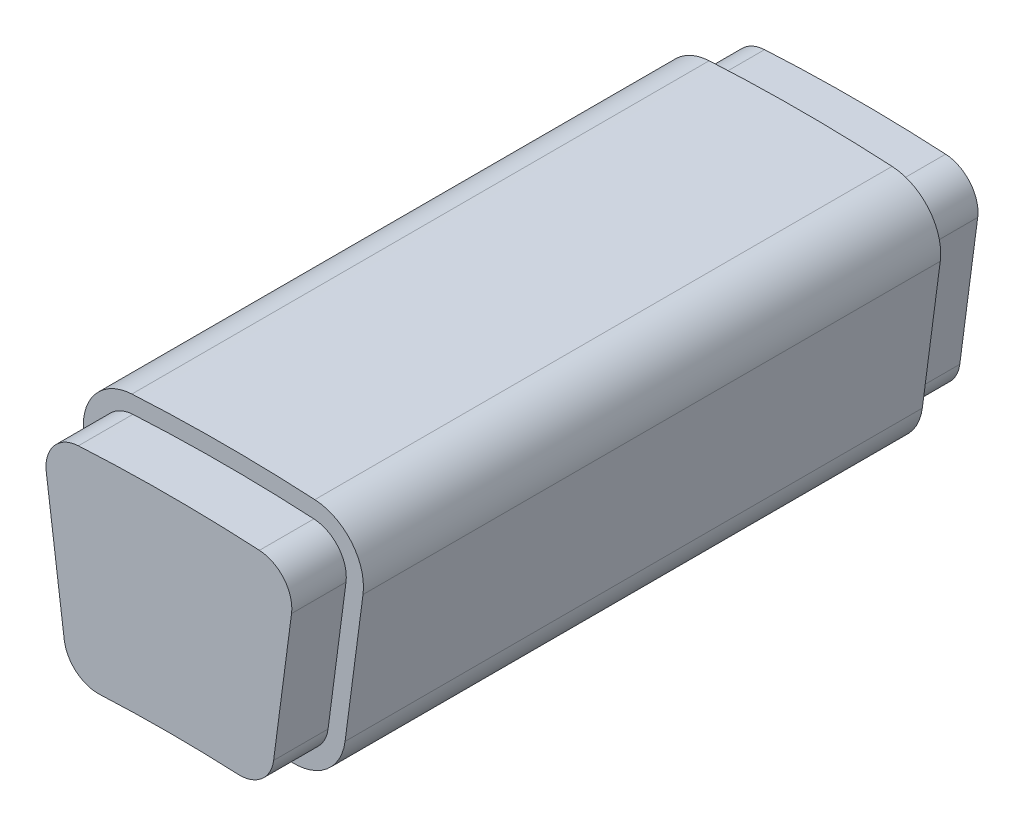
ISO-10303-21;
HEADER;
FILE_DESCRIPTION(('STEP AP214'),'2;1');
FILE_NAME('part.step','',(''),(''),'','','');
FILE_SCHEMA(('AUTOMOTIVE_DESIGN { 1 0 10303 214 1 1 1 1 }'));
ENDSEC;
DATA;
#1=APPLICATION_CONTEXT('core data for automotive mechanical design processes');
#2=APPLICATION_PROTOCOL_DEFINITION('international standard','automotive_design',2000,#1);
#3=PRODUCT_CONTEXT('',#1,'mechanical');
#4=PRODUCT('Part','Part','',(#3));
#5=PRODUCT_RELATED_PRODUCT_CATEGORY('part','',(#4));
#6=PRODUCT_DEFINITION_FORMATION('','',#4);
#7=PRODUCT_DEFINITION_CONTEXT('part definition',#1,'design');
#8=PRODUCT_DEFINITION('design','',#6,#7);
#9=PRODUCT_DEFINITION_SHAPE('','',#8);
#10=(LENGTH_UNIT() NAMED_UNIT(*) SI_UNIT(.MILLI.,.METRE.));
#11=(NAMED_UNIT(*) PLANE_ANGLE_UNIT() SI_UNIT($,.RADIAN.));
#12=(NAMED_UNIT(*) SI_UNIT($,.STERADIAN.) SOLID_ANGLE_UNIT());
#13=UNCERTAINTY_MEASURE_WITH_UNIT(LENGTH_MEASURE(1.E-05),#10,'distance_accuracy_value','');
#14=(GEOMETRIC_REPRESENTATION_CONTEXT(3) GLOBAL_UNCERTAINTY_ASSIGNED_CONTEXT((#13)) GLOBAL_UNIT_ASSIGNED_CONTEXT((#10,
#11,#12)) REPRESENTATION_CONTEXT('',''));
#15=CARTESIAN_POINT('',(0.,0.,0.));
#16=DIRECTION('',(0.,0.,1.));
#17=DIRECTION('',(1.,0.,0.));
#18=AXIS2_PLACEMENT_3D('',#15,#16,#17);
#19=CARTESIAN_POINT('',(5.16524875028588,92.8630424670149,-3.17499999999995));
#20=DIRECTION('',(0.,0.,1.));
#21=DIRECTION('',(1.,0.,0.));
#22=AXIS2_PLACEMENT_3D('',#19,#20,#21);
#23=CYLINDRICAL_SURFACE('',#22,2.00000000000001);
#24=CARTESIAN_POINT('',(5.16524875028588,92.8630424670149,33.65));
#25=DIRECTION('',(0.,0.,1.));
#26=DIRECTION('',(1.,0.,0.));
#27=AXIS2_PLACEMENT_3D('',#24,#25,#26);
#28=CIRCLE('',#27,2.00000000000001);
#29=CARTESIAN_POINT('',(5.27632150648806,94.8599557958376,33.65));
#30=VERTEX_POINT('',#29);
#31=CARTESIAN_POINT('',(7.1481384730335,92.6019900825748,33.65));
#32=VERTEX_POINT('',#31);
#33=EDGE_CURVE('E269',#30,#32,#28,.F.);
#34=ORIENTED_EDGE('',*,*,#33,.F.);
#35=DIRECTION('',(0.,0.,1.));
#36=VECTOR('',#35,1.);
#37=CARTESIAN_POINT('',(5.27632150648806,94.8599557958376,-3.17499999999995));
#38=LINE('',#37,#36);
#39=CARTESIAN_POINT('',(5.27632150648806,94.8599557958376,36.8250000000001));
#40=VERTEX_POINT('',#39);
#41=EDGE_CURVE('E320',#30,#40,#38,.T.);
#42=ORIENTED_EDGE('',*,*,#41,.T.);
#43=CARTESIAN_POINT('',(5.16524875028588,92.8630424670149,36.8250000000001));
#44=DIRECTION('',(0.,0.,1.));
#45=DIRECTION('',(1.,0.,0.));
#46=AXIS2_PLACEMENT_3D('',#43,#44,#45);
#47=CIRCLE('',#46,2.00000000000001);
#48=CARTESIAN_POINT('',(7.1481384730335,92.6019900825748,36.8250000000001));
#49=VERTEX_POINT('',#48);
#50=EDGE_CURVE('E272',#49,#40,#47,.T.);
#51=ORIENTED_EDGE('',*,*,#50,.F.);
#52=DIRECTION('',(0.,0.,1.));
#53=VECTOR('',#52,1.);
#54=CARTESIAN_POINT('',(7.1481384730335,92.6019900825748,-3.17499999999995));
#55=LINE('',#54,#53);
#56=EDGE_CURVE('E324',#32,#49,#55,.T.);
#57=ORIENTED_EDGE('',*,*,#56,.F.);
#58=EDGE_LOOP('',(#34,#42,#51,#57));
#59=FACE_BOUND('',#58,.T.);
#60=ADVANCED_FACE('F43',(#59),#23,.T.);
#61=CARTESIAN_POINT('',(6.10317052287258,84.6646704774741,-3.17499999999995));
#62=DIRECTION('',(0.99144486137381,-0.130526192220053,0.));
#63=DIRECTION('',(0.130526192220053,0.99144486137381,0.));
#64=AXIS2_PLACEMENT_3D('',#61,#62,#63);
#65=PLANE('',#64);
#66=DIRECTION('',(-0.130526192220053,-0.99144486137381,0.));
#67=VECTOR('',#66,1.);
#68=CARTESIAN_POINT('',(6.10317052287258,84.6646704774741,33.65));
#69=LINE('',#68,#67);
#70=CARTESIAN_POINT('',(6.10317052287258,84.6646704774741,33.65));
#71=VERTEX_POINT('',#70);
#72=EDGE_CURVE('E57',#32,#71,#69,.T.);
#73=ORIENTED_EDGE('',*,*,#72,.F.);
#74=ORIENTED_EDGE('',*,*,#56,.T.);
#75=DIRECTION('',(0.130526192220053,0.99144486137381,0.));
#76=VECTOR('',#75,1.);
#77=CARTESIAN_POINT('',(6.10317052287258,84.6646704774741,36.8250000000001));
#78=LINE('',#77,#76);
#79=CARTESIAN_POINT('',(6.10317052287258,84.6646704774741,36.8250000000001));
#80=VERTEX_POINT('',#79);
#81=EDGE_CURVE('E293',#80,#49,#78,.T.);
#82=ORIENTED_EDGE('',*,*,#81,.F.);
#83=DIRECTION('',(0.,0.,1.));
#84=VECTOR('',#83,1.);
#85=CARTESIAN_POINT('',(6.10317052287258,84.6646704774741,-3.17499999999995));
#86=LINE('',#85,#84);
#87=EDGE_CURVE('E328',#71,#80,#86,.T.);
#88=ORIENTED_EDGE('',*,*,#87,.F.);
#89=EDGE_LOOP('',(#73,#74,#82,#88));
#90=FACE_BOUND('',#89,.T.);
#91=ADVANCED_FACE('F453',(#90),#65,.T.);
#92=CARTESIAN_POINT('',(4.12028080012497,84.9257228619142,-3.17499999999995));
#93=DIRECTION('',(0.,0.,1.));
#94=DIRECTION('',(1.,0.,0.));
#95=AXIS2_PLACEMENT_3D('',#92,#93,#94);
#96=CYLINDRICAL_SURFACE('',#95,1.99999999999998);
#97=CARTESIAN_POINT('',(4.12028080012497,84.9257228619142,33.65));
#98=DIRECTION('',(0.,0.,1.));
#99=DIRECTION('',(1.,0.,0.));
#100=AXIS2_PLACEMENT_3D('',#97,#98,#99);
#101=CIRCLE('',#100,1.99999999999998);
#102=CARTESIAN_POINT('',(4.02336222269665,82.9280725448294,33.65));
#103=VERTEX_POINT('',#102);
#104=EDGE_CURVE('E65',#71,#103,#101,.F.);
#105=ORIENTED_EDGE('',*,*,#104,.F.);
#106=ORIENTED_EDGE('',*,*,#87,.T.);
#107=CARTESIAN_POINT('',(4.12028080012497,84.9257228619142,36.8250000000001));
#108=DIRECTION('',(0.,0.,1.));
#109=DIRECTION('',(1.,0.,0.));
#110=AXIS2_PLACEMENT_3D('',#107,#108,#109);
#111=CIRCLE('',#110,1.99999999999998);
#112=CARTESIAN_POINT('',(4.02336222269665,82.9280725448294,36.8250000000001));
#113=VERTEX_POINT('',#112);
#114=EDGE_CURVE('E290',#113,#80,#111,.T.);
#115=ORIENTED_EDGE('',*,*,#114,.F.);
#116=DIRECTION('',(0.,0.,1.));
#117=VECTOR('',#116,1.);
#118=CARTESIAN_POINT('',(4.02336222269665,82.9280725448294,-3.17499999999995));
#119=LINE('',#118,#117);
#120=EDGE_CURVE('E332',#103,#113,#119,.T.);
#121=ORIENTED_EDGE('',*,*,#120,.F.);
#122=EDGE_LOOP('',(#105,#106,#115,#121));
#123=FACE_BOUND('',#122,.T.);
#124=ADVANCED_FACE('F459',(#123),#96,.T.);
#125=CARTESIAN_POINT('',(0.,0.,-3.17499999999995));
#126=DIRECTION('',(0.,0.,1.));
#127=DIRECTION('',(1.,0.,0.));
#128=AXIS2_PLACEMENT_3D('',#125,#126,#127);
#129=CYLINDRICAL_SURFACE('',#128,83.025614478759);
#130=CARTESIAN_POINT('',(0.,0.,33.65));
#131=DIRECTION('',(0.,0.,1.));
#132=DIRECTION('',(1.,0.,0.));
#133=AXIS2_PLACEMENT_3D('',#130,#131,#132);
#134=CIRCLE('',#133,83.025614478759);
#135=CARTESIAN_POINT('',(-4.02336222269665,82.9280725448294,33.65));
#136=VERTEX_POINT('',#135);
#137=EDGE_CURVE('E264',#103,#136,#134,.T.);
#138=ORIENTED_EDGE('',*,*,#137,.F.);
#139=ORIENTED_EDGE('',*,*,#120,.T.);
#140=CARTESIAN_POINT('',(0.,0.,36.8250000000001));
#141=DIRECTION('',(0.,0.,-1.));
#142=DIRECTION('',(1.,0.,0.));
#143=AXIS2_PLACEMENT_3D('',#140,#141,#142);
#144=CIRCLE('',#143,83.025614478759);
#145=CARTESIAN_POINT('',(-4.02336222269665,82.9280725448294,36.8250000000001));
#146=VERTEX_POINT('',#145);
#147=EDGE_CURVE('E287',#146,#113,#144,.T.);
#148=ORIENTED_EDGE('',*,*,#147,.F.);
#149=DIRECTION('',(0.,0.,1.));
#150=VECTOR('',#149,1.);
#151=CARTESIAN_POINT('',(-4.02336222269665,82.9280725448294,-3.17499999999995));
#152=LINE('',#151,#150);
#153=EDGE_CURVE('E336',#136,#146,#152,.T.);
#154=ORIENTED_EDGE('',*,*,#153,.F.);
#155=EDGE_LOOP('',(#138,#139,#148,#154));
#156=FACE_BOUND('',#155,.T.);
#157=ADVANCED_FACE('F474',(#156),#129,.F.);
#158=CARTESIAN_POINT('',(-4.12028080012497,84.9257228619143,-3.17499999999995));
#159=DIRECTION('',(0.,0.,1.));
#160=DIRECTION('',(1.,0.,0.));
#161=AXIS2_PLACEMENT_3D('',#158,#159,#160);
#162=CYLINDRICAL_SURFACE('',#161,2.);
#163=CARTESIAN_POINT('',(-4.12028080012497,84.9257228619143,33.65));
#164=DIRECTION('',(0.,0.,1.));
#165=DIRECTION('',(1.,0.,0.));
#166=AXIS2_PLACEMENT_3D('',#163,#164,#165);
#167=CIRCLE('',#166,2.);
#168=CARTESIAN_POINT('',(-6.10317052287259,84.6646704774742,33.65));
#169=VERTEX_POINT('',#168);
#170=EDGE_CURVE('E261',#136,#169,#167,.F.);
#171=ORIENTED_EDGE('',*,*,#170,.F.);
#172=ORIENTED_EDGE('',*,*,#153,.T.);
#173=CARTESIAN_POINT('',(-4.12028080012497,84.9257228619143,36.8250000000001));
#174=DIRECTION('',(0.,0.,1.));
#175=DIRECTION('',(1.,0.,0.));
#176=AXIS2_PLACEMENT_3D('',#173,#174,#175);
#177=CIRCLE('',#176,2.);
#178=CARTESIAN_POINT('',(-6.10317052287259,84.6646704774742,36.8250000000001));
#179=VERTEX_POINT('',#178);
#180=EDGE_CURVE('E284',#179,#146,#177,.T.);
#181=ORIENTED_EDGE('',*,*,#180,.F.);
#182=DIRECTION('',(0.,0.,1.));
#183=VECTOR('',#182,1.);
#184=CARTESIAN_POINT('',(-6.10317052287259,84.6646704774742,-3.17499999999995));
#185=LINE('',#184,#183);
#186=EDGE_CURVE('E340',#169,#179,#185,.T.);
#187=ORIENTED_EDGE('',*,*,#186,.F.);
#188=EDGE_LOOP('',(#171,#172,#181,#187));
#189=FACE_BOUND('',#188,.T.);
#190=ADVANCED_FACE('F477',(#189),#162,.T.);
#191=CARTESIAN_POINT('',(-7.1481384730335,92.6019900825748,-3.17499999999995));
#192=DIRECTION('',(-0.99144486137381,-0.130526192220052,0.));
#193=DIRECTION('',(0.130526192220052,-0.99144486137381,0.));
#194=AXIS2_PLACEMENT_3D('',#191,#192,#193);
#195=PLANE('',#194);
#196=DIRECTION('',(-0.130526192220052,0.99144486137381,0.));
#197=VECTOR('',#196,1.);
#198=CARTESIAN_POINT('',(-7.1481384730335,92.6019900825748,33.65));
#199=LINE('',#198,#197);
#200=CARTESIAN_POINT('',(-7.1481384730335,92.6019900825748,33.65));
#201=VERTEX_POINT('',#200);
#202=EDGE_CURVE('E258',#169,#201,#199,.T.);
#203=ORIENTED_EDGE('',*,*,#202,.F.);
#204=ORIENTED_EDGE('',*,*,#186,.T.);
#205=DIRECTION('',(0.130526192220052,-0.99144486137381,0.));
#206=VECTOR('',#205,1.);
#207=CARTESIAN_POINT('',(-7.1481384730335,92.6019900825748,36.8250000000001));
#208=LINE('',#207,#206);
#209=CARTESIAN_POINT('',(-7.1481384730335,92.6019900825748,36.8250000000001));
#210=VERTEX_POINT('',#209);
#211=EDGE_CURVE('E281',#210,#179,#208,.T.);
#212=ORIENTED_EDGE('',*,*,#211,.F.);
#213=DIRECTION('',(0.,0.,1.));
#214=VECTOR('',#213,1.);
#215=CARTESIAN_POINT('',(-7.1481384730335,92.6019900825748,-3.17499999999995));
#216=LINE('',#215,#214);
#217=EDGE_CURVE('E344',#201,#210,#216,.T.);
#218=ORIENTED_EDGE('',*,*,#217,.F.);
#219=EDGE_LOOP('',(#203,#204,#212,#218));
#220=FACE_BOUND('',#219,.T.);
#221=ADVANCED_FACE('F481',(#220),#195,.T.);
#222=CARTESIAN_POINT('',(-5.16524875028588,92.8630424670149,-3.17499999999995));
#223=DIRECTION('',(0.,0.,1.));
#224=DIRECTION('',(1.,0.,0.));
#225=AXIS2_PLACEMENT_3D('',#222,#223,#224);
#226=CYLINDRICAL_SURFACE('',#225,1.99999999999999);
#227=CARTESIAN_POINT('',(-5.16524875028588,92.8630424670149,33.65));
#228=DIRECTION('',(0.,0.,1.));
#229=DIRECTION('',(1.,0.,0.));
#230=AXIS2_PLACEMENT_3D('',#227,#228,#229);
#231=CIRCLE('',#230,1.99999999999999);
#232=CARTESIAN_POINT('',(-5.27632150648805,94.8599557958376,33.65));
#233=VERTEX_POINT('',#232);
#234=EDGE_CURVE('E255',#201,#233,#231,.F.);
#235=ORIENTED_EDGE('',*,*,#234,.F.);
#236=ORIENTED_EDGE('',*,*,#217,.T.);
#237=CARTESIAN_POINT('',(-5.16524875028588,92.8630424670149,36.8250000000001));
#238=DIRECTION('',(0.,0.,1.));
#239=DIRECTION('',(1.,0.,0.));
#240=AXIS2_PLACEMENT_3D('',#237,#238,#239);
#241=CIRCLE('',#240,1.99999999999999);
#242=CARTESIAN_POINT('',(-5.27632150648805,94.8599557958376,36.8250000000001));
#243=VERTEX_POINT('',#242);
#244=EDGE_CURVE('E278',#243,#210,#241,.T.);
#245=ORIENTED_EDGE('',*,*,#244,.F.);
#246=DIRECTION('',(0.,0.,1.));
#247=VECTOR('',#246,1.);
#248=CARTESIAN_POINT('',(-5.27632150648805,94.8599557958376,-3.17499999999995));
#249=LINE('',#248,#247);
#250=EDGE_CURVE('E348',#233,#243,#249,.T.);
#251=ORIENTED_EDGE('',*,*,#250,.F.);
#252=EDGE_LOOP('',(#235,#236,#245,#251));
#253=FACE_BOUND('',#252,.T.);
#254=ADVANCED_FACE('F485',(#253),#226,.T.);
#255=CARTESIAN_POINT('',(0.,0.,-3.17499999999995));
#256=DIRECTION('',(0.,0.,1.));
#257=DIRECTION('',(1.,0.,0.));
#258=AXIS2_PLACEMENT_3D('',#255,#256,#257);
#259=CYLINDRICAL_SURFACE('',#258,95.0065828362861);
#260=CARTESIAN_POINT('',(0.,0.,33.65));
#261=DIRECTION('',(0.,0.,1.));
#262=DIRECTION('',(1.,0.,0.));
#263=AXIS2_PLACEMENT_3D('',#260,#261,#262);
#264=CIRCLE('',#263,95.0065828362861);
#265=EDGE_CURVE('E11',#233,#30,#264,.F.);
#266=ORIENTED_EDGE('',*,*,#265,.F.);
#267=ORIENTED_EDGE('',*,*,#250,.T.);
#268=CARTESIAN_POINT('',(0.,0.,36.8250000000001));
#269=DIRECTION('',(0.,0.,1.));
#270=DIRECTION('',(1.,0.,0.));
#271=AXIS2_PLACEMENT_3D('',#268,#269,#270);
#272=CIRCLE('',#271,95.0065828362861);
#273=EDGE_CURVE('E275',#40,#243,#272,.T.);
#274=ORIENTED_EDGE('',*,*,#273,.F.);
#275=ORIENTED_EDGE('',*,*,#41,.F.);
#276=EDGE_LOOP('',(#266,#267,#274,#275));
#277=FACE_BOUND('',#276,.T.);
#278=ADVANCED_FACE('F488',(#277),#259,.T.);
#279=CARTESIAN_POINT('',(5.16524875028588,92.8630424670149,36.8250000000001));
#280=DIRECTION('',(0.,0.,1.));
#281=DIRECTION('',(1.,0.,0.));
#282=AXIS2_PLACEMENT_3D('',#279,#280,#281);
#283=PLANE('',#282);
#284=ORIENTED_EDGE('',*,*,#50,.T.);
#285=ORIENTED_EDGE('',*,*,#273,.T.);
#286=ORIENTED_EDGE('',*,*,#244,.T.);
#287=ORIENTED_EDGE('',*,*,#211,.T.);
#288=ORIENTED_EDGE('',*,*,#180,.T.);
#289=ORIENTED_EDGE('',*,*,#147,.T.);
#290=ORIENTED_EDGE('',*,*,#114,.T.);
#291=ORIENTED_EDGE('',*,*,#81,.T.);
#292=EDGE_LOOP('',(#284,#285,#286,#287,#288,#289,#290,#291));
#293=FACE_BOUND('',#292,.T.);
#294=ADVANCED_FACE('F491',(#293),#283,.T.);
#295=CARTESIAN_POINT('',(5.16524875028588,92.8630424670149,33.65));
#296=DIRECTION('',(0.,0.,-1.));
#297=DIRECTION('',(-1.,0.,0.));
#298=AXIS2_PLACEMENT_3D('',#295,#296,#297);
#299=CYLINDRICAL_SURFACE('',#298,3.00000000000001);
#300=CARTESIAN_POINT('',(5.16524875028588,92.8630424670149,0.));
#301=DIRECTION('',(0.,0.,1.));
#302=DIRECTION('',(1.,0.,0.));
#303=AXIS2_PLACEMENT_3D('',#300,#301,#302);
#304=CIRCLE('',#303,3.00000000000001);
#305=CARTESIAN_POINT('',(8.13958333440732,92.4714638903548,0.));
#306=VERTEX_POINT('',#305);
#307=CARTESIAN_POINT('',(5.33185788458914,95.8584124602489,0.));
#308=VERTEX_POINT('',#307);
#309=EDGE_CURVE('E228',#306,#308,#304,.T.);
#310=ORIENTED_EDGE('',*,*,#309,.T.);
#311=DIRECTION('',(0.,0.,-1.));
#312=VECTOR('',#311,1.);
#313=CARTESIAN_POINT('',(5.33185788458914,95.8584124602489,33.65));
#314=LINE('',#313,#312);
#315=CARTESIAN_POINT('',(5.33185788458914,95.8584124602489,33.65));
#316=VERTEX_POINT('',#315);
#317=EDGE_CURVE('E208',#316,#308,#314,.T.);
#318=ORIENTED_EDGE('',*,*,#317,.F.);
#319=CARTESIAN_POINT('',(5.16524875028588,92.8630424670149,33.65));
#320=DIRECTION('',(0.,0.,1.));
#321=DIRECTION('',(1.,0.,0.));
#322=AXIS2_PLACEMENT_3D('',#319,#320,#321);
#323=CIRCLE('',#322,3.00000000000001);
#324=CARTESIAN_POINT('',(8.13958333440732,92.4714638903548,33.65));
#325=VERTEX_POINT('',#324);
#326=EDGE_CURVE('E215',#325,#316,#323,.T.);
#327=ORIENTED_EDGE('',*,*,#326,.F.);
#328=DIRECTION('',(0.,0.,-1.));
#329=VECTOR('',#328,1.);
#330=CARTESIAN_POINT('',(8.13958333440732,92.4714638903548,33.65));
#331=LINE('',#330,#329);
#332=EDGE_CURVE('E403',#325,#306,#331,.T.);
#333=ORIENTED_EDGE('',*,*,#332,.T.);
#334=EDGE_LOOP('',(#310,#318,#327,#333));
#335=FACE_BOUND('',#334,.T.);
#336=ADVANCED_FACE('F226',(#335),#299,.T.);
#337=CARTESIAN_POINT('',(0.,0.,33.65));
#338=DIRECTION('',(0.,0.,-1.));
#339=DIRECTION('',(-1.,0.,0.));
#340=AXIS2_PLACEMENT_3D('',#337,#338,#339);
#341=CYLINDRICAL_SURFACE('',#340,96.0065828362861);
#342=CARTESIAN_POINT('',(0.,0.,0.));
#343=DIRECTION('',(0.,0.,1.));
#344=DIRECTION('',(1.,0.,0.));
#345=AXIS2_PLACEMENT_3D('',#342,#343,#344);
#346=CIRCLE('',#345,96.0065828362861);
#347=CARTESIAN_POINT('',(-5.33185788458912,95.8584124602489,0.));
#348=VERTEX_POINT('',#347);
#349=EDGE_CURVE('E386',#308,#348,#346,.T.);
#350=ORIENTED_EDGE('',*,*,#349,.T.);
#351=DIRECTION('',(0.,0.,-1.));
#352=VECTOR('',#351,1.);
#353=CARTESIAN_POINT('',(-5.33185788458912,95.8584124602489,33.65));
#354=LINE('',#353,#352);
#355=CARTESIAN_POINT('',(-5.33185788458912,95.8584124602489,33.65));
#356=VERTEX_POINT('',#355);
#357=EDGE_CURVE('E211',#356,#348,#354,.T.);
#358=ORIENTED_EDGE('',*,*,#357,.F.);
#359=CARTESIAN_POINT('',(0.,0.,33.65));
#360=DIRECTION('',(0.,0.,1.));
#361=DIRECTION('',(1.,0.,0.));
#362=AXIS2_PLACEMENT_3D('',#359,#360,#361);
#363=CIRCLE('',#362,96.0065828362861);
#364=EDGE_CURVE('E204',#316,#356,#363,.T.);
#365=ORIENTED_EDGE('',*,*,#364,.F.);
#366=ORIENTED_EDGE('',*,*,#317,.T.);
#367=EDGE_LOOP('',(#350,#358,#365,#366));
#368=FACE_BOUND('',#367,.T.);
#369=ADVANCED_FACE('F206',(#368),#341,.T.);
#370=CARTESIAN_POINT('',(-5.16524875028588,92.8630424670149,33.65));
#371=DIRECTION('',(0.,0.,-1.));
#372=DIRECTION('',(-1.,0.,0.));
#373=AXIS2_PLACEMENT_3D('',#370,#371,#372);
#374=CYLINDRICAL_SURFACE('',#373,2.99999999999999);
#375=CARTESIAN_POINT('',(-5.16524875028588,92.8630424670149,0.));
#376=DIRECTION('',(0.,0.,1.));
#377=DIRECTION('',(1.,0.,0.));
#378=AXIS2_PLACEMENT_3D('',#375,#376,#377);
#379=CIRCLE('',#378,2.99999999999999);
#380=CARTESIAN_POINT('',(-8.1395833344073,92.4714638903548,0.));
#381=VERTEX_POINT('',#380);
#382=EDGE_CURVE('E388',#348,#381,#379,.T.);
#383=ORIENTED_EDGE('',*,*,#382,.T.);
#384=DIRECTION('',(0.,0.,-1.));
#385=VECTOR('',#384,1.);
#386=CARTESIAN_POINT('',(-8.1395833344073,92.4714638903548,33.65));
#387=LINE('',#386,#385);
#388=CARTESIAN_POINT('',(-8.1395833344073,92.4714638903548,33.65));
#389=VERTEX_POINT('',#388);
#390=EDGE_CURVE('E234',#389,#381,#387,.T.);
#391=ORIENTED_EDGE('',*,*,#390,.F.);
#392=CARTESIAN_POINT('',(-5.16524875028588,92.8630424670149,33.65));
#393=DIRECTION('',(0.,0.,1.));
#394=DIRECTION('',(1.,0.,0.));
#395=AXIS2_PLACEMENT_3D('',#392,#393,#394);
#396=CIRCLE('',#395,2.99999999999999);
#397=EDGE_CURVE('E214',#356,#389,#396,.T.);
#398=ORIENTED_EDGE('',*,*,#397,.F.);
#399=ORIENTED_EDGE('',*,*,#357,.T.);
#400=EDGE_LOOP('',(#383,#391,#398,#399));
#401=FACE_BOUND('',#400,.T.);
#402=ADVANCED_FACE('F443',(#401),#374,.T.);
#403=CARTESIAN_POINT('',(-8.1395833344073,92.4714638903548,33.65));
#404=DIRECTION('',(0.991444861373811,0.130526192220051,0.));
#405=DIRECTION('',(-0.130526192220051,0.991444861373811,0.));
#406=AXIS2_PLACEMENT_3D('',#403,#404,#405);
#407=PLANE('',#406);
#408=DIRECTION('',(0.130526192220051,-0.99144486137381,0.));
#409=VECTOR('',#408,1.);
#410=CARTESIAN_POINT('',(-8.1395833344073,92.4714638903548,0.));
#411=LINE('',#410,#409);
#412=CARTESIAN_POINT('',(-7.0946153842464,84.5341442852541,0.));
#413=VERTEX_POINT('',#412);
#414=EDGE_CURVE('E394',#381,#413,#411,.T.);
#415=ORIENTED_EDGE('',*,*,#414,.T.);
#416=DIRECTION('',(0.,0.,-1.));
#417=VECTOR('',#416,1.);
#418=CARTESIAN_POINT('',(-7.0946153842464,84.5341442852541,33.65));
#419=LINE('',#418,#417);
#420=CARTESIAN_POINT('',(-7.0946153842464,84.5341442852541,33.65));
#421=VERTEX_POINT('',#420);
#422=EDGE_CURVE('E414',#421,#413,#419,.T.);
#423=ORIENTED_EDGE('',*,*,#422,.F.);
#424=DIRECTION('',(0.130526192220051,-0.99144486137381,0.));
#425=VECTOR('',#424,1.);
#426=CARTESIAN_POINT('',(-8.1395833344073,92.4714638903548,33.65));
#427=LINE('',#426,#425);
#428=EDGE_CURVE('E423',#389,#421,#427,.T.);
#429=ORIENTED_EDGE('',*,*,#428,.F.);
#430=ORIENTED_EDGE('',*,*,#390,.T.);
#431=EDGE_LOOP('',(#415,#423,#429,#430));
#432=FACE_BOUND('',#431,.T.);
#433=ADVANCED_FACE('F421',(#432),#407,.F.);
#434=CARTESIAN_POINT('',(-4.12028080012497,84.9257228619143,33.65));
#435=DIRECTION('',(0.,0.,-1.));
#436=DIRECTION('',(-1.,0.,0.));
#437=AXIS2_PLACEMENT_3D('',#434,#435,#436);
#438=CYLINDRICAL_SURFACE('',#437,3.);
#439=CARTESIAN_POINT('',(-4.12028080012497,84.9257228619143,0.));
#440=DIRECTION('',(0.,0.,1.));
#441=DIRECTION('',(1.,0.,0.));
#442=AXIS2_PLACEMENT_3D('',#439,#440,#441);
#443=CIRCLE('',#442,3.);
#444=CARTESIAN_POINT('',(-3.9749029339825,81.929247386287,0.));
#445=VERTEX_POINT('',#444);
#446=EDGE_CURVE('E396',#413,#445,#443,.T.);
#447=ORIENTED_EDGE('',*,*,#446,.T.);
#448=DIRECTION('',(0.,0.,-1.));
#449=VECTOR('',#448,1.);
#450=CARTESIAN_POINT('',(-3.9749029339825,81.929247386287,33.65));
#451=LINE('',#450,#449);
#452=CARTESIAN_POINT('',(-3.9749029339825,81.929247386287,33.65));
#453=VERTEX_POINT('',#452);
#454=EDGE_CURVE('E411',#453,#445,#451,.T.);
#455=ORIENTED_EDGE('',*,*,#454,.F.);
#456=CARTESIAN_POINT('',(-4.12028080012497,84.9257228619143,33.65));
#457=DIRECTION('',(0.,0.,1.));
#458=DIRECTION('',(1.,0.,0.));
#459=AXIS2_PLACEMENT_3D('',#456,#457,#458);
#460=CIRCLE('',#459,3.);
#461=EDGE_CURVE('E438',#421,#453,#460,.T.);
#462=ORIENTED_EDGE('',*,*,#461,.F.);
#463=ORIENTED_EDGE('',*,*,#422,.T.);
#464=EDGE_LOOP('',(#447,#455,#462,#463));
#465=FACE_BOUND('',#464,.T.);
#466=ADVANCED_FACE('F429',(#465),#438,.T.);
#467=CARTESIAN_POINT('',(0.,0.,33.65));
#468=DIRECTION('',(0.,0.,-1.));
#469=DIRECTION('',(-1.,0.,0.));
#470=AXIS2_PLACEMENT_3D('',#467,#468,#469);
#471=CYLINDRICAL_SURFACE('',#470,82.025614478759);
#472=CARTESIAN_POINT('',(0.,0.,0.));
#473=DIRECTION('',(0.,0.,-1.));
#474=DIRECTION('',(1.,0.,0.));
#475=AXIS2_PLACEMENT_3D('',#472,#473,#474);
#476=CIRCLE('',#475,82.025614478759);
#477=CARTESIAN_POINT('',(3.9749029339825,81.929247386287,0.));
#478=VERTEX_POINT('',#477);
#479=EDGE_CURVE('E398',#445,#478,#476,.T.);
#480=ORIENTED_EDGE('',*,*,#479,.T.);
#481=DIRECTION('',(0.,0.,-1.));
#482=VECTOR('',#481,1.);
#483=CARTESIAN_POINT('',(3.9749029339825,81.929247386287,33.65));
#484=LINE('',#483,#482);
#485=CARTESIAN_POINT('',(3.9749029339825,81.929247386287,33.65));
#486=VERTEX_POINT('',#485);
#487=EDGE_CURVE('E408',#486,#478,#484,.T.);
#488=ORIENTED_EDGE('',*,*,#487,.F.);
#489=CARTESIAN_POINT('',(0.,0.,33.65));
#490=DIRECTION('',(0.,0.,-1.));
#491=DIRECTION('',(1.,0.,0.));
#492=AXIS2_PLACEMENT_3D('',#489,#490,#491);
#493=CIRCLE('',#492,82.025614478759);
#494=EDGE_CURVE('E435',#453,#486,#493,.T.);
#495=ORIENTED_EDGE('',*,*,#494,.F.);
#496=ORIENTED_EDGE('',*,*,#454,.T.);
#497=EDGE_LOOP('',(#480,#488,#495,#496));
#498=FACE_BOUND('',#497,.T.);
#499=ADVANCED_FACE('F433',(#498),#471,.F.);
#500=CARTESIAN_POINT('',(4.12028080012497,84.9257228619142,33.65));
#501=DIRECTION('',(0.,0.,-1.));
#502=DIRECTION('',(-1.,0.,0.));
#503=AXIS2_PLACEMENT_3D('',#500,#501,#502);
#504=CYLINDRICAL_SURFACE('',#503,2.99999999999998);
#505=CARTESIAN_POINT('',(4.12028080012497,84.9257228619142,0.));
#506=DIRECTION('',(0.,0.,1.));
#507=DIRECTION('',(1.,0.,0.));
#508=AXIS2_PLACEMENT_3D('',#505,#506,#507);
#509=CIRCLE('',#508,2.99999999999998);
#510=CARTESIAN_POINT('',(7.09461538424638,84.5341442852541,0.));
#511=VERTEX_POINT('',#510);
#512=EDGE_CURVE('E400',#478,#511,#509,.T.);
#513=ORIENTED_EDGE('',*,*,#512,.T.);
#514=DIRECTION('',(0.,0.,-1.));
#515=VECTOR('',#514,1.);
#516=CARTESIAN_POINT('',(7.09461538424638,84.5341442852541,33.65));
#517=LINE('',#516,#515);
#518=CARTESIAN_POINT('',(7.09461538424638,84.5341442852541,33.65));
#519=VERTEX_POINT('',#518);
#520=EDGE_CURVE('E405',#519,#511,#517,.T.);
#521=ORIENTED_EDGE('',*,*,#520,.F.);
#522=CARTESIAN_POINT('',(4.12028080012497,84.9257228619142,33.65));
#523=DIRECTION('',(0.,0.,1.));
#524=DIRECTION('',(1.,0.,0.));
#525=AXIS2_PLACEMENT_3D('',#522,#523,#524);
#526=CIRCLE('',#525,2.99999999999998);
#527=EDGE_CURVE('E437',#486,#519,#526,.T.);
#528=ORIENTED_EDGE('',*,*,#527,.F.);
#529=ORIENTED_EDGE('',*,*,#487,.T.);
#530=EDGE_LOOP('',(#513,#521,#528,#529));
#531=FACE_BOUND('',#530,.T.);
#532=ADVANCED_FACE('F590',(#531),#504,.T.);
#533=CARTESIAN_POINT('',(7.09461538424638,84.5341442852541,33.65));
#534=DIRECTION('',(-0.99144486137381,0.130526192220055,0.));
#535=DIRECTION('',(-0.130526192220055,-0.99144486137381,0.));
#536=AXIS2_PLACEMENT_3D('',#533,#534,#535);
#537=PLANE('',#536);
#538=DIRECTION('',(0.130526192220055,0.99144486137381,0.));
#539=VECTOR('',#538,1.);
#540=CARTESIAN_POINT('',(7.09461538424638,84.5341442852541,0.));
#541=LINE('',#540,#539);
#542=EDGE_CURVE('E224',#511,#306,#541,.T.);
#543=ORIENTED_EDGE('',*,*,#542,.T.);
#544=ORIENTED_EDGE('',*,*,#332,.F.);
#545=DIRECTION('',(0.130526192220055,0.99144486137381,0.));
#546=VECTOR('',#545,1.);
#547=CARTESIAN_POINT('',(7.09461538424638,84.5341442852541,33.65));
#548=LINE('',#547,#546);
#549=EDGE_CURVE('E220',#519,#325,#548,.T.);
#550=ORIENTED_EDGE('',*,*,#549,.F.);
#551=ORIENTED_EDGE('',*,*,#520,.T.);
#552=EDGE_LOOP('',(#543,#544,#550,#551));
#553=FACE_BOUND('',#552,.T.);
#554=ADVANCED_FACE('F599',(#553),#537,.F.);
#555=CARTESIAN_POINT('',(5.16524875028588,92.8630424670149,33.65));
#556=DIRECTION('',(0.,0.,1.));
#557=DIRECTION('',(1.,0.,0.));
#558=AXIS2_PLACEMENT_3D('',#555,#556,#557);
#559=PLANE('',#558);
#560=ORIENTED_EDGE('',*,*,#265,.T.);
#561=ORIENTED_EDGE('',*,*,#33,.T.);
#562=ORIENTED_EDGE('',*,*,#72,.T.);
#563=ORIENTED_EDGE('',*,*,#104,.T.);
#564=ORIENTED_EDGE('',*,*,#137,.T.);
#565=ORIENTED_EDGE('',*,*,#170,.T.);
#566=ORIENTED_EDGE('',*,*,#202,.T.);
#567=ORIENTED_EDGE('',*,*,#234,.T.);
#568=EDGE_LOOP('',(#560,#561,#562,#563,#564,#565,#566,#567));
#569=FACE_BOUND('',#568,.T.);
#570=ORIENTED_EDGE('',*,*,#326,.T.);
#571=ORIENTED_EDGE('',*,*,#364,.T.);
#572=ORIENTED_EDGE('',*,*,#397,.T.);
#573=ORIENTED_EDGE('',*,*,#428,.T.);
#574=ORIENTED_EDGE('',*,*,#461,.T.);
#575=ORIENTED_EDGE('',*,*,#494,.T.);
#576=ORIENTED_EDGE('',*,*,#527,.T.);
#577=ORIENTED_EDGE('',*,*,#549,.T.);
#578=EDGE_LOOP('',(#570,#571,#572,#573,#574,#575,#576,#577));
#579=FACE_BOUND('',#578,.T.);
#580=ADVANCED_FACE('F218',(#569,#579),#559,.T.);
#581=CARTESIAN_POINT('',(5.16524875028588,92.8630424670149,0.));
#582=DIRECTION('',(0.,0.,1.));
#583=DIRECTION('',(1.,0.,0.));
#584=AXIS2_PLACEMENT_3D('',#581,#582,#583);
#585=PLANE('',#584);
#586=CARTESIAN_POINT('',(5.16524875028588,92.8630424670149,0.));
#587=DIRECTION('',(0.,0.,1.));
#588=DIRECTION('',(1.,0.,0.));
#589=AXIS2_PLACEMENT_3D('',#586,#587,#588);
#590=CIRCLE('',#589,2.00000000000001);
#591=CARTESIAN_POINT('',(5.27632150648806,94.8599557958376,0.));
#592=VERTEX_POINT('',#591);
#593=CARTESIAN_POINT('',(7.1481384730335,92.6019900825748,0.));
#594=VERTEX_POINT('',#593);
#595=EDGE_CURVE('E252',#592,#594,#590,.F.);
#596=ORIENTED_EDGE('',*,*,#595,.F.);
#597=CARTESIAN_POINT('',(0.,0.,0.));
#598=DIRECTION('',(0.,0.,1.));
#599=DIRECTION('',(1.,0.,0.));
#600=AXIS2_PLACEMENT_3D('',#597,#598,#599);
#601=CIRCLE('',#600,95.0065828362861);
#602=CARTESIAN_POINT('',(-5.27632150648805,94.8599557958376,0.));
#603=VERTEX_POINT('',#602);
#604=EDGE_CURVE('E50',#603,#592,#601,.F.);
#605=ORIENTED_EDGE('',*,*,#604,.F.);
#606=CARTESIAN_POINT('',(-5.16524875028588,92.8630424670149,0.));
#607=DIRECTION('',(0.,0.,1.));
#608=DIRECTION('',(1.,0.,0.));
#609=AXIS2_PLACEMENT_3D('',#606,#607,#608);
#610=CIRCLE('',#609,1.99999999999999);
#611=CARTESIAN_POINT('',(-7.14813847303349,92.6019900825748,0.));
#612=VERTEX_POINT('',#611);
#613=EDGE_CURVE('E229',#612,#603,#610,.F.);
#614=ORIENTED_EDGE('',*,*,#613,.F.);
#615=DIRECTION('',(-0.130526192220052,0.99144486137381,0.));
#616=VECTOR('',#615,1.);
#617=CARTESIAN_POINT('',(-7.1481384730335,92.6019900825748,0.));
#618=LINE('',#617,#616);
#619=CARTESIAN_POINT('',(-6.10317052287259,84.6646704774742,0.));
#620=VERTEX_POINT('',#619);
#621=EDGE_CURVE('E232',#620,#612,#618,.T.);
#622=ORIENTED_EDGE('',*,*,#621,.F.);
#623=CARTESIAN_POINT('',(-4.12028080012497,84.9257228619143,0.));
#624=DIRECTION('',(0.,0.,1.));
#625=DIRECTION('',(1.,0.,0.));
#626=AXIS2_PLACEMENT_3D('',#623,#624,#625);
#627=CIRCLE('',#626,2.);
#628=CARTESIAN_POINT('',(-4.02336222269665,82.9280725448294,0.));
#629=VERTEX_POINT('',#628);
#630=EDGE_CURVE('E240',#629,#620,#627,.F.);
#631=ORIENTED_EDGE('',*,*,#630,.F.);
#632=CARTESIAN_POINT('',(0.,0.,0.));
#633=DIRECTION('',(0.,0.,1.));
#634=DIRECTION('',(1.,0.,0.));
#635=AXIS2_PLACEMENT_3D('',#632,#633,#634);
#636=CIRCLE('',#635,83.025614478759);
#637=CARTESIAN_POINT('',(4.02336222269665,82.9280725448294,0.));
#638=VERTEX_POINT('',#637);
#639=EDGE_CURVE('E243',#638,#629,#636,.T.);
#640=ORIENTED_EDGE('',*,*,#639,.F.);
#641=CARTESIAN_POINT('',(4.12028080012497,84.9257228619142,0.));
#642=DIRECTION('',(0.,0.,1.));
#643=DIRECTION('',(1.,0.,0.));
#644=AXIS2_PLACEMENT_3D('',#641,#642,#643);
#645=CIRCLE('',#644,1.99999999999998);
#646=CARTESIAN_POINT('',(6.10317052287258,84.6646704774741,0.));
#647=VERTEX_POINT('',#646);
#648=EDGE_CURVE('E246',#647,#638,#645,.F.);
#649=ORIENTED_EDGE('',*,*,#648,.F.);
#650=DIRECTION('',(-0.130526192220053,-0.99144486137381,0.));
#651=VECTOR('',#650,1.);
#652=CARTESIAN_POINT('',(6.10317052287258,84.6646704774741,0.));
#653=LINE('',#652,#651);
#654=EDGE_CURVE('E249',#594,#647,#653,.T.);
#655=ORIENTED_EDGE('',*,*,#654,.F.);
#656=EDGE_LOOP('',(#596,#605,#614,#622,#631,#640,#649,#655));
#657=FACE_BOUND('',#656,.T.);
#658=ORIENTED_EDGE('',*,*,#309,.F.);
#659=ORIENTED_EDGE('',*,*,#542,.F.);
#660=ORIENTED_EDGE('',*,*,#512,.F.);
#661=ORIENTED_EDGE('',*,*,#479,.F.);
#662=ORIENTED_EDGE('',*,*,#446,.F.);
#663=ORIENTED_EDGE('',*,*,#414,.F.);
#664=ORIENTED_EDGE('',*,*,#382,.F.);
#665=ORIENTED_EDGE('',*,*,#349,.F.);
#666=EDGE_LOOP('',(#658,#659,#660,#661,#662,#663,#664,#665));
#667=FACE_BOUND('',#666,.T.);
#668=ADVANCED_FACE('F379',(#657,#667),#585,.F.);
#669=CARTESIAN_POINT('',(5.16524875028588,92.8630424670149,-3.17499999999995));
#670=DIRECTION('',(0.,0.,1.));
#671=DIRECTION('',(1.,0.,0.));
#672=AXIS2_PLACEMENT_3D('',#669,#670,#671);
#673=PLANE('',#672);
#674=CARTESIAN_POINT('',(5.16524875028588,92.8630424670149,-3.17499999999995));
#675=DIRECTION('',(0.,0.,1.));
#676=DIRECTION('',(1.,0.,0.));
#677=AXIS2_PLACEMENT_3D('',#674,#675,#676);
#678=CIRCLE('',#677,2.00000000000001);
#679=CARTESIAN_POINT('',(7.1481384730335,92.6019900825748,-3.17499999999995));
#680=VERTEX_POINT('',#679);
#681=CARTESIAN_POINT('',(5.27632150648806,94.8599557958376,-3.17499999999995));
#682=VERTEX_POINT('',#681);
#683=EDGE_CURVE('E296',#680,#682,#678,.T.);
#684=ORIENTED_EDGE('',*,*,#683,.F.);
#685=DIRECTION('',(0.130526192220053,0.99144486137381,0.));
#686=VECTOR('',#685,1.);
#687=CARTESIAN_POINT('',(6.10317052287258,84.6646704774741,-3.17499999999995));
#688=LINE('',#687,#686);
#689=CARTESIAN_POINT('',(6.10317052287258,84.6646704774741,-3.17499999999995));
#690=VERTEX_POINT('',#689);
#691=EDGE_CURVE('E317',#690,#680,#688,.T.);
#692=ORIENTED_EDGE('',*,*,#691,.F.);
#693=CARTESIAN_POINT('',(4.12028080012497,84.9257228619142,-3.17499999999995));
#694=DIRECTION('',(0.,0.,1.));
#695=DIRECTION('',(1.,0.,0.));
#696=AXIS2_PLACEMENT_3D('',#693,#694,#695);
#697=CIRCLE('',#696,1.99999999999998);
#698=CARTESIAN_POINT('',(4.02336222269665,82.9280725448294,-3.17499999999995));
#699=VERTEX_POINT('',#698);
#700=EDGE_CURVE('E314',#699,#690,#697,.T.);
#701=ORIENTED_EDGE('',*,*,#700,.F.);
#702=CARTESIAN_POINT('',(0.,0.,-3.17499999999995));
#703=DIRECTION('',(0.,0.,-1.));
#704=DIRECTION('',(1.,0.,0.));
#705=AXIS2_PLACEMENT_3D('',#702,#703,#704);
#706=CIRCLE('',#705,83.025614478759);
#707=CARTESIAN_POINT('',(-4.02336222269665,82.9280725448294,-3.17499999999995));
#708=VERTEX_POINT('',#707);
#709=EDGE_CURVE('E311',#708,#699,#706,.T.);
#710=ORIENTED_EDGE('',*,*,#709,.F.);
#711=CARTESIAN_POINT('',(-4.12028080012497,84.9257228619143,-3.17499999999995));
#712=DIRECTION('',(0.,0.,1.));
#713=DIRECTION('',(1.,0.,0.));
#714=AXIS2_PLACEMENT_3D('',#711,#712,#713);
#715=CIRCLE('',#714,2.);
#716=CARTESIAN_POINT('',(-6.10317052287259,84.6646704774742,-3.17499999999995));
#717=VERTEX_POINT('',#716);
#718=EDGE_CURVE('E308',#717,#708,#715,.T.);
#719=ORIENTED_EDGE('',*,*,#718,.F.);
#720=DIRECTION('',(0.130526192220052,-0.99144486137381,0.));
#721=VECTOR('',#720,1.);
#722=CARTESIAN_POINT('',(-7.1481384730335,92.6019900825748,-3.17499999999995));
#723=LINE('',#722,#721);
#724=CARTESIAN_POINT('',(-7.1481384730335,92.6019900825748,-3.17499999999995));
#725=VERTEX_POINT('',#724);
#726=EDGE_CURVE('E305',#725,#717,#723,.T.);
#727=ORIENTED_EDGE('',*,*,#726,.F.);
#728=CARTESIAN_POINT('',(-5.16524875028588,92.8630424670149,-3.17499999999995));
#729=DIRECTION('',(0.,0.,1.));
#730=DIRECTION('',(1.,0.,0.));
#731=AXIS2_PLACEMENT_3D('',#728,#729,#730);
#732=CIRCLE('',#731,1.99999999999999);
#733=CARTESIAN_POINT('',(-5.27632150648805,94.8599557958376,-3.17499999999995));
#734=VERTEX_POINT('',#733);
#735=EDGE_CURVE('E302',#734,#725,#732,.T.);
#736=ORIENTED_EDGE('',*,*,#735,.F.);
#737=CARTESIAN_POINT('',(0.,0.,-3.17499999999995));
#738=DIRECTION('',(0.,0.,1.));
#739=DIRECTION('',(1.,0.,0.));
#740=AXIS2_PLACEMENT_3D('',#737,#738,#739);
#741=CIRCLE('',#740,95.0065828362861);
#742=EDGE_CURVE('E299',#682,#734,#741,.T.);
#743=ORIENTED_EDGE('',*,*,#742,.F.);
#744=EDGE_LOOP('',(#684,#692,#701,#710,#719,#727,#736,#743));
#745=FACE_BOUND('',#744,.T.);
#746=ADVANCED_FACE('F361',(#745),#673,.F.);
#747=EDGE_CURVE('E345',#734,#603,#249,.T.);
#748=ORIENTED_EDGE('',*,*,#747,.T.);
#749=ORIENTED_EDGE('',*,*,#604,.T.);
#750=EDGE_CURVE('E349',#682,#592,#38,.T.);
#751=ORIENTED_EDGE('',*,*,#750,.F.);
#752=ORIENTED_EDGE('',*,*,#742,.T.);
#753=EDGE_LOOP('',(#748,#749,#751,#752));
#754=FACE_BOUND('',#753,.T.);
#755=ADVANCED_FACE('F353',(#754),#259,.T.);
#756=EDGE_CURVE('E341',#725,#612,#216,.T.);
#757=ORIENTED_EDGE('',*,*,#756,.T.);
#758=ORIENTED_EDGE('',*,*,#613,.T.);
#759=ORIENTED_EDGE('',*,*,#747,.F.);
#760=ORIENTED_EDGE('',*,*,#735,.T.);
#761=EDGE_LOOP('',(#757,#758,#759,#760));
#762=FACE_BOUND('',#761,.T.);
#763=ADVANCED_FACE('F378',(#762),#226,.T.);
#764=EDGE_CURVE('E337',#717,#620,#185,.T.);
#765=ORIENTED_EDGE('',*,*,#764,.T.);
#766=ORIENTED_EDGE('',*,*,#621,.T.);
#767=ORIENTED_EDGE('',*,*,#756,.F.);
#768=ORIENTED_EDGE('',*,*,#726,.T.);
#769=EDGE_LOOP('',(#765,#766,#767,#768));
#770=FACE_BOUND('',#769,.T.);
#771=ADVANCED_FACE('F376',(#770),#195,.T.);
#772=EDGE_CURVE('E333',#708,#629,#152,.T.);
#773=ORIENTED_EDGE('',*,*,#772,.T.);
#774=ORIENTED_EDGE('',*,*,#630,.T.);
#775=ORIENTED_EDGE('',*,*,#764,.F.);
#776=ORIENTED_EDGE('',*,*,#718,.T.);
#777=EDGE_LOOP('',(#773,#774,#775,#776));
#778=FACE_BOUND('',#777,.T.);
#779=ADVANCED_FACE('F373',(#778),#162,.T.);
#780=EDGE_CURVE('E329',#699,#638,#119,.T.);
#781=ORIENTED_EDGE('',*,*,#780,.T.);
#782=ORIENTED_EDGE('',*,*,#639,.T.);
#783=ORIENTED_EDGE('',*,*,#772,.F.);
#784=ORIENTED_EDGE('',*,*,#709,.T.);
#785=EDGE_LOOP('',(#781,#782,#783,#784));
#786=FACE_BOUND('',#785,.T.);
#787=ADVANCED_FACE('F371',(#786),#129,.F.);
#788=EDGE_CURVE('E325',#690,#647,#86,.T.);
#789=ORIENTED_EDGE('',*,*,#788,.T.);
#790=ORIENTED_EDGE('',*,*,#648,.T.);
#791=ORIENTED_EDGE('',*,*,#780,.F.);
#792=ORIENTED_EDGE('',*,*,#700,.T.);
#793=EDGE_LOOP('',(#789,#790,#791,#792));
#794=FACE_BOUND('',#793,.T.);
#795=ADVANCED_FACE('F367',(#794),#96,.T.);
#796=EDGE_CURVE('E321',#680,#594,#55,.T.);
#797=ORIENTED_EDGE('',*,*,#796,.T.);
#798=ORIENTED_EDGE('',*,*,#654,.T.);
#799=ORIENTED_EDGE('',*,*,#788,.F.);
#800=ORIENTED_EDGE('',*,*,#691,.T.);
#801=EDGE_LOOP('',(#797,#798,#799,#800));
#802=FACE_BOUND('',#801,.T.);
#803=ADVANCED_FACE('F365',(#802),#65,.T.);
#804=ORIENTED_EDGE('',*,*,#750,.T.);
#805=ORIENTED_EDGE('',*,*,#595,.T.);
#806=ORIENTED_EDGE('',*,*,#796,.F.);
#807=ORIENTED_EDGE('',*,*,#683,.T.);
#808=EDGE_LOOP('',(#804,#805,#806,#807));
#809=FACE_BOUND('',#808,.T.);
#810=ADVANCED_FACE('F357',(#809),#23,.T.);
#811=CLOSED_SHELL('',(#60,#91,#124,#157,#190,#221,#254,#278,#294,#336,#369,#402,#433,#466,#499,
#532,#554,#580,#668,#746,#755,#763,#771,#779,#787,#795,#803,#810));
#812=MANIFOLD_SOLID_BREP('B2',#811);
#813=ADVANCED_BREP_SHAPE_REPRESENTATION('',(#18,#812),#14);
#814=SHAPE_DEFINITION_REPRESENTATION(#9,#813);
ENDSEC;
END-ISO-10303-21;
